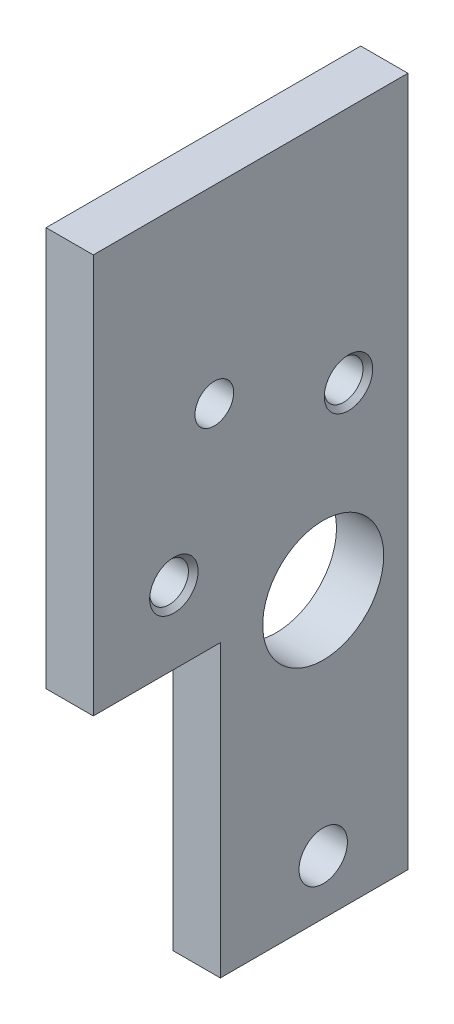
ISO-10303-21;
HEADER;
FILE_DESCRIPTION(('STEP AP214'),'2;1');
FILE_NAME('part.step','',(''),(''),'','','');
FILE_SCHEMA(('AUTOMOTIVE_DESIGN { 1 0 10303 214 1 1 1 1 }'));
ENDSEC;
DATA;
#1=APPLICATION_CONTEXT('core data for automotive mechanical design processes');
#2=APPLICATION_PROTOCOL_DEFINITION('international standard','automotive_design',2000,#1);
#3=PRODUCT_CONTEXT('',#1,'mechanical');
#4=PRODUCT('Part','Part','',(#3));
#5=PRODUCT_RELATED_PRODUCT_CATEGORY('part','',(#4));
#6=PRODUCT_DEFINITION_FORMATION('','',#4);
#7=PRODUCT_DEFINITION_CONTEXT('part definition',#1,'design');
#8=PRODUCT_DEFINITION('design','',#6,#7);
#9=PRODUCT_DEFINITION_SHAPE('','',#8);
#10=(LENGTH_UNIT() NAMED_UNIT(*) SI_UNIT(.MILLI.,.METRE.));
#11=(NAMED_UNIT(*) PLANE_ANGLE_UNIT() SI_UNIT($,.RADIAN.));
#12=(NAMED_UNIT(*) SI_UNIT($,.STERADIAN.) SOLID_ANGLE_UNIT());
#13=UNCERTAINTY_MEASURE_WITH_UNIT(LENGTH_MEASURE(1.E-05),#10,'distance_accuracy_value','');
#14=(GEOMETRIC_REPRESENTATION_CONTEXT(3) GLOBAL_UNCERTAINTY_ASSIGNED_CONTEXT((#13)) GLOBAL_UNIT_ASSIGNED_CONTEXT((#10,
#11,#12)) REPRESENTATION_CONTEXT('',''));
#15=CARTESIAN_POINT('',(0.,0.,0.));
#16=DIRECTION('',(0.,0.,1.));
#17=DIRECTION('',(1.,0.,0.));
#18=AXIS2_PLACEMENT_3D('',#15,#16,#17);
#19=CARTESIAN_POINT('',(-3.9,0.,0.));
#20=DIRECTION('',(0.,0.,-1.));
#21=DIRECTION('',(0.,1.,0.));
#22=AXIS2_PLACEMENT_3D('',#19,#20,#21);
#23=PLANE('',#22);
#24=DIRECTION('',(0.,1.,0.));
#25=VECTOR('',#24,1.);
#26=CARTESIAN_POINT('',(0.,0.,0.));
#27=LINE('',#26,#25);
#28=CARTESIAN_POINT('',(0.,0.,0.));
#29=VERTEX_POINT('',#28);
#30=CARTESIAN_POINT('',(0.,57.,0.));
#31=VERTEX_POINT('',#30);
#32=EDGE_CURVE('E106',#29,#31,#27,.T.);
#33=ORIENTED_EDGE('',*,*,#32,.F.);
#34=DIRECTION('',(1.,0.,0.));
#35=VECTOR('',#34,1.);
#36=CARTESIAN_POINT('',(-3.9,0.,0.));
#37=LINE('',#36,#35);
#38=CARTESIAN_POINT('',(-3.9,0.,0.));
#39=VERTEX_POINT('',#38);
#40=EDGE_CURVE('E11',#39,#29,#37,.T.);
#41=ORIENTED_EDGE('',*,*,#40,.F.);
#42=DIRECTION('',(0.,1.,0.));
#43=VECTOR('',#42,1.);
#44=CARTESIAN_POINT('',(-3.9,0.,0.));
#45=LINE('',#44,#43);
#46=CARTESIAN_POINT('',(-3.9,57.,0.));
#47=VERTEX_POINT('',#46);
#48=EDGE_CURVE('E109',#39,#47,#45,.T.);
#49=ORIENTED_EDGE('',*,*,#48,.T.);
#50=DIRECTION('',(1.,0.,0.));
#51=VECTOR('',#50,1.);
#52=CARTESIAN_POINT('',(-3.9,57.,0.));
#53=LINE('',#52,#51);
#54=EDGE_CURVE('E36',#47,#31,#53,.T.);
#55=ORIENTED_EDGE('',*,*,#54,.T.);
#56=EDGE_LOOP('',(#33,#41,#49,#55));
#57=FACE_BOUND('',#56,.T.);
#58=ADVANCED_FACE('F33',(#57),#23,.T.);
#59=CARTESIAN_POINT('',(-3.9,0.,0.));
#60=DIRECTION('',(0.,-1.,0.));
#61=DIRECTION('',(0.,0.,-1.));
#62=AXIS2_PLACEMENT_3D('',#59,#60,#61);
#63=PLANE('',#62);
#64=DIRECTION('',(1.,0.,0.));
#65=VECTOR('',#64,1.);
#66=CARTESIAN_POINT('',(-3.9,0.,15.5));
#67=LINE('',#66,#65);
#68=CARTESIAN_POINT('',(-3.9,0.,15.5));
#69=VERTEX_POINT('',#68);
#70=CARTESIAN_POINT('',(0.,0.,15.5));
#71=VERTEX_POINT('',#70);
#72=EDGE_CURVE('E55',#69,#71,#67,.T.);
#73=ORIENTED_EDGE('',*,*,#72,.F.);
#74=DIRECTION('',(0.,0.,-1.));
#75=VECTOR('',#74,1.);
#76=CARTESIAN_POINT('',(-3.9,0.,0.));
#77=LINE('',#76,#75);
#78=EDGE_CURVE('E114',#69,#39,#77,.T.);
#79=ORIENTED_EDGE('',*,*,#78,.T.);
#80=ORIENTED_EDGE('',*,*,#40,.T.);
#81=DIRECTION('',(0.,0.,-1.));
#82=VECTOR('',#81,1.);
#83=CARTESIAN_POINT('',(0.,0.,0.));
#84=LINE('',#83,#82);
#85=EDGE_CURVE('E107',#71,#29,#84,.T.);
#86=ORIENTED_EDGE('',*,*,#85,.F.);
#87=EDGE_LOOP('',(#73,#79,#80,#86));
#88=FACE_BOUND('',#87,.T.);
#89=ADVANCED_FACE('F184',(#88),#63,.T.);
#90=CARTESIAN_POINT('',(-3.9,57.,0.));
#91=DIRECTION('',(0.,1.,0.));
#92=DIRECTION('',(0.,0.,1.));
#93=AXIS2_PLACEMENT_3D('',#90,#91,#92);
#94=PLANE('',#93);
#95=DIRECTION('',(-1.,0.,0.));
#96=VECTOR('',#95,1.);
#97=CARTESIAN_POINT('',(0.,57.,26.));
#98=LINE('',#97,#96);
#99=CARTESIAN_POINT('',(0.,57.,26.));
#100=VERTEX_POINT('',#99);
#101=CARTESIAN_POINT('',(-3.9,57.,26.));
#102=VERTEX_POINT('',#101);
#103=EDGE_CURVE('E87',#100,#102,#98,.T.);
#104=ORIENTED_EDGE('',*,*,#103,.F.);
#105=DIRECTION('',(0.,0.,1.));
#106=VECTOR('',#105,1.);
#107=CARTESIAN_POINT('',(0.,57.,0.));
#108=LINE('',#107,#106);
#109=EDGE_CURVE('E98',#31,#100,#108,.T.);
#110=ORIENTED_EDGE('',*,*,#109,.F.);
#111=ORIENTED_EDGE('',*,*,#54,.F.);
#112=DIRECTION('',(0.,0.,1.));
#113=VECTOR('',#112,1.);
#114=CARTESIAN_POINT('',(-3.9,57.,0.));
#115=LINE('',#114,#113);
#116=EDGE_CURVE('E101',#47,#102,#115,.T.);
#117=ORIENTED_EDGE('',*,*,#116,.T.);
#118=EDGE_LOOP('',(#104,#110,#111,#117));
#119=FACE_BOUND('',#118,.T.);
#120=ADVANCED_FACE('F97',(#119),#94,.T.);
#121=CARTESIAN_POINT('',(-3.9,0.,0.));
#122=DIRECTION('',(1.,0.,0.));
#123=DIRECTION('',(0.,0.,-1.));
#124=AXIS2_PLACEMENT_3D('',#121,#122,#123);
#125=PLANE('',#124);
#126=CARTESIAN_POINT('',(-3.9,30.0326086873371,19.3396657899873));
#127=DIRECTION('',(1.,0.,0.));
#128=DIRECTION('',(0.,0.,-1.));
#129=AXIS2_PLACEMENT_3D('',#126,#127,#128);
#130=CIRCLE('',#129,1.6);
#131=CARTESIAN_POINT('',(-3.9,30.0326086873371,17.7396657899873));
#132=VERTEX_POINT('',#131);
#133=EDGE_CURVE('E164',#132,#132,#130,.T.);
#134=ORIENTED_EDGE('',*,*,#133,.T.);
#135=EDGE_LOOP('',(#134));
#136=FACE_BOUND('',#135,.T.);
#137=CARTESIAN_POINT('',(-3.9,37.3046086873371,4.90832434159796));
#138=DIRECTION('',(1.,0.,0.));
#139=DIRECTION('',(0.,0.,-1.));
#140=AXIS2_PLACEMENT_3D('',#137,#138,#139);
#141=CIRCLE('',#140,1.6);
#142=CARTESIAN_POINT('',(-3.9,37.3046086873371,3.30832434159796));
#143=VERTEX_POINT('',#142);
#144=EDGE_CURVE('E155',#143,#143,#141,.T.);
#145=ORIENTED_EDGE('',*,*,#144,.T.);
#146=EDGE_LOOP('',(#145));
#147=FACE_BOUND('',#146,.T.);
#148=CARTESIAN_POINT('',(-3.9,41.3605710994918,16.));
#149=DIRECTION('',(-1.,0.,0.));
#150=DIRECTION('',(0.,0.,1.));
#151=AXIS2_PLACEMENT_3D('',#148,#149,#150);
#152=CIRCLE('',#151,4.5);
#153=CARTESIAN_POINT('',(-3.9,41.3605710994918,20.5));
#154=VERTEX_POINT('',#153);
#155=EDGE_CURVE('E152',#154,#154,#152,.T.);
#156=ORIENTED_EDGE('',*,*,#155,.F.);
#157=EDGE_LOOP('',(#156));
#158=FACE_BOUND('',#157,.T.);
#159=CARTESIAN_POINT('',(-3.9,4.5,7.));
#160=DIRECTION('',(1.,0.,0.));
#161=DIRECTION('',(0.,0.,-1.));
#162=AXIS2_PLACEMENT_3D('',#159,#160,#161);
#163=CIRCLE('',#162,2.);
#164=CARTESIAN_POINT('',(-3.9,4.5,5.));
#165=VERTEX_POINT('',#164);
#166=EDGE_CURVE('E122',#165,#165,#163,.T.);
#167=ORIENTED_EDGE('',*,*,#166,.T.);
#168=EDGE_LOOP('',(#167));
#169=FACE_BOUND('',#168,.T.);
#170=CARTESIAN_POINT('',(-3.9,23.5,7.));
#171=DIRECTION('',(1.,0.,0.));
#172=DIRECTION('',(0.,0.,-1.));
#173=AXIS2_PLACEMENT_3D('',#170,#171,#172);
#174=CIRCLE('',#173,5.);
#175=CARTESIAN_POINT('',(-3.9,23.5,2.));
#176=VERTEX_POINT('',#175);
#177=EDGE_CURVE('E111',#176,#176,#174,.T.);
#178=ORIENTED_EDGE('',*,*,#177,.T.);
#179=EDGE_LOOP('',(#178));
#180=FACE_BOUND('',#179,.T.);
#181=DIRECTION('',(0.,0.,1.));
#182=VECTOR('',#181,1.);
#183=CARTESIAN_POINT('',(-3.9,24.,30.));
#184=LINE('',#183,#182);
#185=CARTESIAN_POINT('',(-3.9,24.,15.5));
#186=VERTEX_POINT('',#185);
#187=CARTESIAN_POINT('',(-3.9,24.,26.));
#188=VERTEX_POINT('',#187);
#189=EDGE_CURVE('E132',#186,#188,#184,.T.);
#190=ORIENTED_EDGE('',*,*,#189,.T.);
#191=DIRECTION('',(0.,-1.,0.));
#192=VECTOR('',#191,1.);
#193=CARTESIAN_POINT('',(-3.9,24.,26.));
#194=LINE('',#193,#192);
#195=EDGE_CURVE('E47',#102,#188,#194,.T.);
#196=ORIENTED_EDGE('',*,*,#195,.F.);
#197=ORIENTED_EDGE('',*,*,#116,.F.);
#198=ORIENTED_EDGE('',*,*,#48,.F.);
#199=ORIENTED_EDGE('',*,*,#78,.F.);
#200=DIRECTION('',(0.,1.,0.));
#201=VECTOR('',#200,1.);
#202=CARTESIAN_POINT('',(-3.9,0.,15.5));
#203=LINE('',#202,#201);
#204=EDGE_CURVE('E136',#69,#186,#203,.T.);
#205=ORIENTED_EDGE('',*,*,#204,.T.);
#206=EDGE_LOOP('',(#190,#196,#197,#198,#199,#205));
#207=FACE_BOUND('',#206,.T.);
#208=ADVANCED_FACE('F178',(#136,#147,#158,#169,#180,#207),#125,.F.);
#209=CARTESIAN_POINT('',(0.,0.,0.));
#210=DIRECTION('',(1.,0.,0.));
#211=DIRECTION('',(0.,0.,-1.));
#212=AXIS2_PLACEMENT_3D('',#209,#210,#211);
#213=PLANE('',#212);
#214=DIRECTION('',(0.,-1.,0.));
#215=VECTOR('',#214,1.);
#216=CARTESIAN_POINT('',(0.,24.,26.));
#217=LINE('',#216,#215);
#218=CARTESIAN_POINT('',(0.,24.,26.));
#219=VERTEX_POINT('',#218);
#220=EDGE_CURVE('E84',#100,#219,#217,.T.);
#221=ORIENTED_EDGE('',*,*,#220,.T.);
#222=DIRECTION('',(0.,0.,1.));
#223=VECTOR('',#222,1.);
#224=CARTESIAN_POINT('',(0.,24.,30.));
#225=LINE('',#224,#223);
#226=CARTESIAN_POINT('',(0.,24.,15.5));
#227=VERTEX_POINT('',#226);
#228=EDGE_CURVE('E134',#227,#219,#225,.T.);
#229=ORIENTED_EDGE('',*,*,#228,.F.);
#230=DIRECTION('',(0.,1.,0.));
#231=VECTOR('',#230,1.);
#232=CARTESIAN_POINT('',(0.,0.,15.5));
#233=LINE('',#232,#231);
#234=EDGE_CURVE('E137',#71,#227,#233,.T.);
#235=ORIENTED_EDGE('',*,*,#234,.F.);
#236=ORIENTED_EDGE('',*,*,#85,.T.);
#237=ORIENTED_EDGE('',*,*,#32,.T.);
#238=ORIENTED_EDGE('',*,*,#109,.T.);
#239=EDGE_LOOP('',(#221,#229,#235,#236,#237,#238));
#240=FACE_BOUND('',#239,.T.);
#241=CARTESIAN_POINT('',(0.,30.0326086873371,19.3396657899873));
#242=DIRECTION('',(1.,0.,0.));
#243=DIRECTION('',(0.,0.,-1.));
#244=AXIS2_PLACEMENT_3D('',#241,#242,#243);
#245=CIRCLE('',#244,2.);
#246=CARTESIAN_POINT('',(0.,30.0326086873371,17.3396657899873));
#247=VERTEX_POINT('',#246);
#248=EDGE_CURVE('E170',#247,#247,#245,.T.);
#249=ORIENTED_EDGE('',*,*,#248,.F.);
#250=EDGE_LOOP('',(#249));
#251=FACE_BOUND('',#250,.T.);
#252=CARTESIAN_POINT('',(0.,37.3046086873371,4.90832434159796));
#253=DIRECTION('',(1.,0.,0.));
#254=DIRECTION('',(0.,0.,-1.));
#255=AXIS2_PLACEMENT_3D('',#252,#253,#254);
#256=CIRCLE('',#255,2.);
#257=CARTESIAN_POINT('',(0.,37.3046086873371,2.90832434159796));
#258=VERTEX_POINT('',#257);
#259=EDGE_CURVE('E161',#258,#258,#256,.T.);
#260=ORIENTED_EDGE('',*,*,#259,.F.);
#261=EDGE_LOOP('',(#260));
#262=FACE_BOUND('',#261,.T.);
#263=CARTESIAN_POINT('',(0.,41.3605710994918,16.));
#264=DIRECTION('',(-1.,0.,0.));
#265=DIRECTION('',(0.,0.,1.));
#266=AXIS2_PLACEMENT_3D('',#263,#264,#265);
#267=CIRCLE('',#266,1.6);
#268=CARTESIAN_POINT('',(0.,41.3605710994918,17.6));
#269=VERTEX_POINT('',#268);
#270=EDGE_CURVE('E139',#269,#269,#267,.T.);
#271=ORIENTED_EDGE('',*,*,#270,.T.);
#272=EDGE_LOOP('',(#271));
#273=FACE_BOUND('',#272,.T.);
#274=CARTESIAN_POINT('',(0.,4.5,7.));
#275=DIRECTION('',(1.,0.,0.));
#276=DIRECTION('',(0.,0.,-1.));
#277=AXIS2_PLACEMENT_3D('',#274,#275,#276);
#278=CIRCLE('',#277,2.);
#279=CARTESIAN_POINT('',(0.,4.5,5.));
#280=VERTEX_POINT('',#279);
#281=EDGE_CURVE('E127',#280,#280,#278,.T.);
#282=ORIENTED_EDGE('',*,*,#281,.F.);
#283=EDGE_LOOP('',(#282));
#284=FACE_BOUND('',#283,.T.);
#285=CARTESIAN_POINT('',(0.,23.5,7.));
#286=DIRECTION('',(1.,0.,0.));
#287=DIRECTION('',(0.,0.,-1.));
#288=AXIS2_PLACEMENT_3D('',#285,#286,#287);
#289=CIRCLE('',#288,5.);
#290=CARTESIAN_POINT('',(0.,23.5,2.));
#291=VERTEX_POINT('',#290);
#292=EDGE_CURVE('E119',#291,#291,#289,.T.);
#293=ORIENTED_EDGE('',*,*,#292,.F.);
#294=EDGE_LOOP('',(#293));
#295=FACE_BOUND('',#294,.T.);
#296=ADVANCED_FACE('F103',(#240,#251,#262,#273,#284,#295),#213,.T.);
#297=CARTESIAN_POINT('',(-3.9,23.5,7.));
#298=DIRECTION('',(1.,0.,0.));
#299=DIRECTION('',(0.,0.,-1.));
#300=AXIS2_PLACEMENT_3D('',#297,#298,#299);
#301=CYLINDRICAL_SURFACE('',#300,5.);
#302=ORIENTED_EDGE('',*,*,#177,.F.);
#303=EDGE_LOOP('',(#302));
#304=FACE_BOUND('',#303,.T.);
#305=ORIENTED_EDGE('',*,*,#292,.T.);
#306=EDGE_LOOP('',(#305));
#307=FACE_BOUND('',#306,.T.);
#308=ADVANCED_FACE('F198',(#304,#307),#301,.F.);
#309=CARTESIAN_POINT('',(0.,4.5,7.));
#310=DIRECTION('',(1.,0.,0.));
#311=DIRECTION('',(0.,0.,-1.));
#312=AXIS2_PLACEMENT_3D('',#309,#310,#311);
#313=CYLINDRICAL_SURFACE('',#312,2.);
#314=ORIENTED_EDGE('',*,*,#166,.F.);
#315=EDGE_LOOP('',(#314));
#316=FACE_BOUND('',#315,.T.);
#317=ORIENTED_EDGE('',*,*,#281,.T.);
#318=EDGE_LOOP('',(#317));
#319=FACE_BOUND('',#318,.T.);
#320=ADVANCED_FACE('F204',(#316,#319),#313,.F.);
#321=CARTESIAN_POINT('',(-3.9,24.,30.));
#322=DIRECTION('',(0.,1.,0.));
#323=DIRECTION('',(0.,0.,1.));
#324=AXIS2_PLACEMENT_3D('',#321,#322,#323);
#325=PLANE('',#324);
#326=ORIENTED_EDGE('',*,*,#228,.T.);
#327=DIRECTION('',(-1.,0.,0.));
#328=VECTOR('',#327,1.);
#329=CARTESIAN_POINT('',(0.,24.,26.));
#330=LINE('',#329,#328);
#331=EDGE_CURVE('E88',#219,#188,#330,.T.);
#332=ORIENTED_EDGE('',*,*,#331,.T.);
#333=ORIENTED_EDGE('',*,*,#189,.F.);
#334=DIRECTION('',(1.,0.,0.));
#335=VECTOR('',#334,1.);
#336=CARTESIAN_POINT('',(-3.9,24.,15.5));
#337=LINE('',#336,#335);
#338=EDGE_CURVE('E130',#186,#227,#337,.T.);
#339=ORIENTED_EDGE('',*,*,#338,.T.);
#340=EDGE_LOOP('',(#326,#332,#333,#339));
#341=FACE_BOUND('',#340,.T.);
#342=ADVANCED_FACE('F176',(#341),#325,.F.);
#343=CARTESIAN_POINT('',(-3.9,0.,15.5));
#344=DIRECTION('',(0.,0.,-1.));
#345=DIRECTION('',(-1.,0.,0.));
#346=AXIS2_PLACEMENT_3D('',#343,#344,#345);
#347=PLANE('',#346);
#348=ORIENTED_EDGE('',*,*,#234,.T.);
#349=ORIENTED_EDGE('',*,*,#338,.F.);
#350=ORIENTED_EDGE('',*,*,#204,.F.);
#351=ORIENTED_EDGE('',*,*,#72,.T.);
#352=EDGE_LOOP('',(#348,#349,#350,#351));
#353=FACE_BOUND('',#352,.T.);
#354=ADVANCED_FACE('F181',(#353),#347,.F.);
#355=CARTESIAN_POINT('',(-3.9,41.3605710994918,16.));
#356=DIRECTION('',(-1.,0.,0.));
#357=DIRECTION('',(0.,0.,1.));
#358=AXIS2_PLACEMENT_3D('',#355,#356,#357);
#359=CYLINDRICAL_SURFACE('',#358,1.6);
#360=ORIENTED_EDGE('',*,*,#270,.F.);
#361=EDGE_LOOP('',(#360));
#362=FACE_BOUND('',#361,.T.);
#363=CARTESIAN_POINT('',(-2.9,41.3605710994918,16.));
#364=DIRECTION('',(-1.,0.,0.));
#365=DIRECTION('',(0.,0.,1.));
#366=AXIS2_PLACEMENT_3D('',#363,#364,#365);
#367=CIRCLE('',#366,1.6);
#368=CARTESIAN_POINT('',(-2.9,41.3605710994918,17.6));
#369=VERTEX_POINT('',#368);
#370=EDGE_CURVE('E146',#369,#369,#367,.T.);
#371=ORIENTED_EDGE('',*,*,#370,.T.);
#372=EDGE_LOOP('',(#371));
#373=FACE_BOUND('',#372,.T.);
#374=ADVANCED_FACE('F211',(#362,#373),#359,.F.);
#375=CARTESIAN_POINT('',(-2.9,42.9605710994917,16.));
#376=DIRECTION('',(1.,0.,0.));
#377=DIRECTION('',(0.,0.,-1.));
#378=AXIS2_PLACEMENT_3D('',#375,#376,#377);
#379=PLANE('',#378);
#380=ORIENTED_EDGE('',*,*,#370,.F.);
#381=EDGE_LOOP('',(#380));
#382=FACE_BOUND('',#381,.T.);
#383=CARTESIAN_POINT('',(-2.9,41.3605710994918,16.));
#384=DIRECTION('',(-1.,0.,0.));
#385=DIRECTION('',(0.,0.,1.));
#386=AXIS2_PLACEMENT_3D('',#383,#384,#385);
#387=CIRCLE('',#386,4.5);
#388=CARTESIAN_POINT('',(-2.9,41.3605710994918,20.5));
#389=VERTEX_POINT('',#388);
#390=EDGE_CURVE('E149',#389,#389,#387,.T.);
#391=ORIENTED_EDGE('',*,*,#390,.T.);
#392=EDGE_LOOP('',(#391));
#393=FACE_BOUND('',#392,.T.);
#394=ADVANCED_FACE('F216',(#382,#393),#379,.F.);
#395=CARTESIAN_POINT('',(-3.9,41.3605710994918,16.));
#396=DIRECTION('',(-1.,0.,0.));
#397=DIRECTION('',(0.,0.,1.));
#398=AXIS2_PLACEMENT_3D('',#395,#396,#397);
#399=CYLINDRICAL_SURFACE('',#398,4.5);
#400=ORIENTED_EDGE('',*,*,#390,.F.);
#401=EDGE_LOOP('',(#400));
#402=FACE_BOUND('',#401,.T.);
#403=ORIENTED_EDGE('',*,*,#155,.T.);
#404=EDGE_LOOP('',(#403));
#405=FACE_BOUND('',#404,.T.);
#406=ADVANCED_FACE('F220',(#402,#405),#399,.F.);
#407=CARTESIAN_POINT('',(0.,37.3046086873371,4.90832434159796));
#408=DIRECTION('',(1.,0.,0.));
#409=DIRECTION('',(0.,0.,-1.));
#410=AXIS2_PLACEMENT_3D('',#407,#408,#409);
#411=CYLINDRICAL_SURFACE('',#410,1.6);
#412=ORIENTED_EDGE('',*,*,#144,.F.);
#413=EDGE_LOOP('',(#412));
#414=FACE_BOUND('',#413,.T.);
#415=CARTESIAN_POINT('',(-0.4,37.3046086873371,4.90832434159796));
#416=DIRECTION('',(1.,0.,0.));
#417=DIRECTION('',(0.,0.,-1.));
#418=AXIS2_PLACEMENT_3D('',#415,#416,#417);
#419=CIRCLE('',#418,1.6);
#420=CARTESIAN_POINT('',(-0.4,37.3046086873371,3.30832434159796));
#421=VERTEX_POINT('',#420);
#422=EDGE_CURVE('E158',#421,#421,#419,.T.);
#423=ORIENTED_EDGE('',*,*,#422,.T.);
#424=EDGE_LOOP('',(#423));
#425=FACE_BOUND('',#424,.T.);
#426=ADVANCED_FACE('F224',(#414,#425),#411,.F.);
#427=CARTESIAN_POINT('',(0.,37.3046086873371,4.90832434159796));
#428=DIRECTION('',(1.,0.,0.));
#429=DIRECTION('',(0.,0.,-1.));
#430=AXIS2_PLACEMENT_3D('',#427,#428,#429);
#431=CONICAL_SURFACE('',#430,2.,0.785398163397454);
#432=ORIENTED_EDGE('',*,*,#422,.F.);
#433=EDGE_LOOP('',(#432));
#434=FACE_BOUND('',#433,.T.);
#435=ORIENTED_EDGE('',*,*,#259,.T.);
#436=EDGE_LOOP('',(#435));
#437=FACE_BOUND('',#436,.T.);
#438=ADVANCED_FACE('F228',(#434,#437),#431,.F.);
#439=CARTESIAN_POINT('',(0.,30.0326086873371,19.3396657899873));
#440=DIRECTION('',(1.,0.,0.));
#441=DIRECTION('',(0.,0.,-1.));
#442=AXIS2_PLACEMENT_3D('',#439,#440,#441);
#443=CYLINDRICAL_SURFACE('',#442,1.6);
#444=ORIENTED_EDGE('',*,*,#133,.F.);
#445=EDGE_LOOP('',(#444));
#446=FACE_BOUND('',#445,.T.);
#447=CARTESIAN_POINT('',(-0.4,30.0326086873371,19.3396657899873));
#448=DIRECTION('',(1.,0.,0.));
#449=DIRECTION('',(0.,0.,-1.));
#450=AXIS2_PLACEMENT_3D('',#447,#448,#449);
#451=CIRCLE('',#450,1.6);
#452=CARTESIAN_POINT('',(-0.4,30.0326086873371,17.7396657899873));
#453=VERTEX_POINT('',#452);
#454=EDGE_CURVE('E167',#453,#453,#451,.T.);
#455=ORIENTED_EDGE('',*,*,#454,.T.);
#456=EDGE_LOOP('',(#455));
#457=FACE_BOUND('',#456,.T.);
#458=ADVANCED_FACE('F232',(#446,#457),#443,.F.);
#459=CARTESIAN_POINT('',(0.,30.0326086873371,19.3396657899873));
#460=DIRECTION('',(1.,0.,0.));
#461=DIRECTION('',(0.,0.,-1.));
#462=AXIS2_PLACEMENT_3D('',#459,#460,#461);
#463=CONICAL_SURFACE('',#462,2.,0.785398163397445);
#464=ORIENTED_EDGE('',*,*,#454,.F.);
#465=EDGE_LOOP('',(#464));
#466=FACE_BOUND('',#465,.T.);
#467=ORIENTED_EDGE('',*,*,#248,.T.);
#468=EDGE_LOOP('',(#467));
#469=FACE_BOUND('',#468,.T.);
#470=ADVANCED_FACE('F236',(#466,#469),#463,.F.);
#471=CARTESIAN_POINT('',(0.,24.,26.));
#472=DIRECTION('',(0.,0.,-1.));
#473=DIRECTION('',(-1.,0.,0.));
#474=AXIS2_PLACEMENT_3D('',#471,#472,#473);
#475=PLANE('',#474);
#476=ORIENTED_EDGE('',*,*,#195,.T.);
#477=ORIENTED_EDGE('',*,*,#331,.F.);
#478=ORIENTED_EDGE('',*,*,#220,.F.);
#479=ORIENTED_EDGE('',*,*,#103,.T.);
#480=EDGE_LOOP('',(#476,#477,#478,#479));
#481=FACE_BOUND('',#480,.T.);
#482=ADVANCED_FACE('F86',(#481),#475,.F.);
#483=CLOSED_SHELL('',(#58,#89,#120,#208,#296,#308,#320,#342,#354,#374,#394,#406,#426,#438,#458,
#470,#482));
#484=MANIFOLD_SOLID_BREP('B2',#483);
#485=ADVANCED_BREP_SHAPE_REPRESENTATION('',(#18,#484),#14);
#486=SHAPE_DEFINITION_REPRESENTATION(#9,#485);
ENDSEC;
END-ISO-10303-21;
